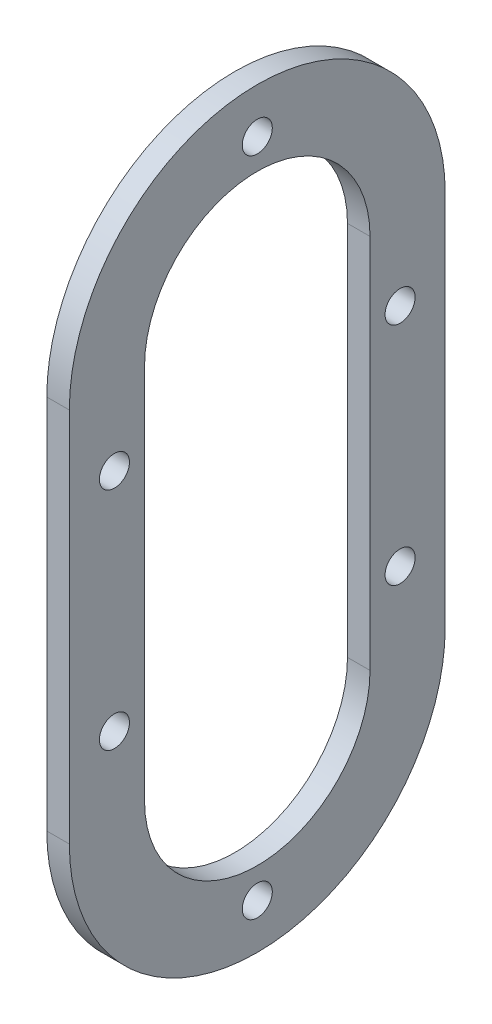
ISO-10303-21;
HEADER;
FILE_DESCRIPTION(('STEP AP214'),'2;1');
FILE_NAME('part.step','',(''),(''),'','','');
FILE_SCHEMA(('AUTOMOTIVE_DESIGN { 1 0 10303 214 1 1 1 1 }'));
ENDSEC;
DATA;
#1=APPLICATION_CONTEXT('core data for automotive mechanical design processes');
#2=APPLICATION_PROTOCOL_DEFINITION('international standard','automotive_design',2000,#1);
#3=PRODUCT_CONTEXT('',#1,'mechanical');
#4=PRODUCT('Part','Part','',(#3));
#5=PRODUCT_RELATED_PRODUCT_CATEGORY('part','',(#4));
#6=PRODUCT_DEFINITION_FORMATION('','',#4);
#7=PRODUCT_DEFINITION_CONTEXT('part definition',#1,'design');
#8=PRODUCT_DEFINITION('design','',#6,#7);
#9=PRODUCT_DEFINITION_SHAPE('','',#8);
#10=(LENGTH_UNIT() NAMED_UNIT(*) SI_UNIT(.MILLI.,.METRE.));
#11=(NAMED_UNIT(*) PLANE_ANGLE_UNIT() SI_UNIT($,.RADIAN.));
#12=(NAMED_UNIT(*) SI_UNIT($,.STERADIAN.) SOLID_ANGLE_UNIT());
#13=UNCERTAINTY_MEASURE_WITH_UNIT(LENGTH_MEASURE(1.E-05),#10,'distance_accuracy_value','');
#14=(GEOMETRIC_REPRESENTATION_CONTEXT(3) GLOBAL_UNCERTAINTY_ASSIGNED_CONTEXT((#13)) GLOBAL_UNIT_ASSIGNED_CONTEXT((#10,
#11,#12)) REPRESENTATION_CONTEXT('',''));
#15=CARTESIAN_POINT('',(0.,0.,0.));
#16=DIRECTION('',(0.,0.,1.));
#17=DIRECTION('',(1.,0.,0.));
#18=AXIS2_PLACEMENT_3D('',#15,#16,#17);
#19=CARTESIAN_POINT('',(3.,0.,0.));
#20=DIRECTION('',(1.,0.,0.));
#21=DIRECTION('',(0.,0.,-1.));
#22=AXIS2_PLACEMENT_3D('',#19,#20,#21);
#23=PLANE('',#22);
#24=CARTESIAN_POINT('',(3.,10.,-19.));
#25=DIRECTION('',(1.,0.,0.));
#26=DIRECTION('',(0.,0.,-1.));
#27=AXIS2_PLACEMENT_3D('',#24,#25,#26);
#28=CIRCLE('',#27,2.);
#29=CARTESIAN_POINT('',(3.,10.,-21.));
#30=VERTEX_POINT('',#29);
#31=EDGE_CURVE('E261',#30,#30,#28,.T.);
#32=ORIENTED_EDGE('',*,*,#31,.F.);
#33=EDGE_LOOP('',(#32));
#34=FACE_BOUND('',#33,.T.);
#35=CARTESIAN_POINT('',(3.,69.,0.));
#36=DIRECTION('',(1.,0.,0.));
#37=DIRECTION('',(0.,0.,-1.));
#38=AXIS2_PLACEMENT_3D('',#35,#36,#37);
#39=CIRCLE('',#38,2.);
#40=CARTESIAN_POINT('',(3.,69.,-2.));
#41=VERTEX_POINT('',#40);
#42=EDGE_CURVE('E273',#41,#41,#39,.T.);
#43=ORIENTED_EDGE('',*,*,#42,.F.);
#44=EDGE_LOOP('',(#43));
#45=FACE_BOUND('',#44,.T.);
#46=CARTESIAN_POINT('',(3.,10.,19.));
#47=DIRECTION('',(1.,0.,0.));
#48=DIRECTION('',(0.,0.,-1.));
#49=AXIS2_PLACEMENT_3D('',#46,#47,#48);
#50=CIRCLE('',#49,2.);
#51=CARTESIAN_POINT('',(3.,10.,17.));
#52=VERTEX_POINT('',#51);
#53=EDGE_CURVE('E135',#52,#52,#50,.T.);
#54=ORIENTED_EDGE('',*,*,#53,.F.);
#55=EDGE_LOOP('',(#54));
#56=FACE_BOUND('',#55,.T.);
#57=CARTESIAN_POINT('',(3.,0.,0.));
#58=DIRECTION('',(1.,0.,0.));
#59=DIRECTION('',(0.,0.,-1.));
#60=AXIS2_PLACEMENT_3D('',#57,#58,#59);
#61=CIRCLE('',#60,25.);
#62=CARTESIAN_POINT('',(3.,0.,25.));
#63=VERTEX_POINT('',#62);
#64=CARTESIAN_POINT('',(3.,0.,-25.));
#65=VERTEX_POINT('',#64);
#66=EDGE_CURVE('E145',#63,#65,#61,.T.);
#67=ORIENTED_EDGE('',*,*,#66,.T.);
#68=DIRECTION('',(0.,1.,0.));
#69=VECTOR('',#68,1.);
#70=CARTESIAN_POINT('',(3.,0.,-25.));
#71=LINE('',#70,#69);
#72=CARTESIAN_POINT('',(3.,50.,-25.));
#73=VERTEX_POINT('',#72);
#74=EDGE_CURVE('E148',#65,#73,#71,.T.);
#75=ORIENTED_EDGE('',*,*,#74,.T.);
#76=CARTESIAN_POINT('',(3.,50.,0.));
#77=DIRECTION('',(1.,0.,0.));
#78=DIRECTION('',(0.,0.,-1.));
#79=AXIS2_PLACEMENT_3D('',#76,#77,#78);
#80=CIRCLE('',#79,25.);
#81=CARTESIAN_POINT('',(3.,50.,25.));
#82=VERTEX_POINT('',#81);
#83=EDGE_CURVE('E151',#73,#82,#80,.T.);
#84=ORIENTED_EDGE('',*,*,#83,.T.);
#85=DIRECTION('',(0.,-1.,0.));
#86=VECTOR('',#85,1.);
#87=CARTESIAN_POINT('',(3.,0.,25.));
#88=LINE('',#87,#86);
#89=EDGE_CURVE('E153',#82,#63,#88,.T.);
#90=ORIENTED_EDGE('',*,*,#89,.T.);
#91=EDGE_LOOP('',(#67,#75,#84,#90));
#92=FACE_BOUND('',#91,.T.);
#93=DIRECTION('',(0.,1.,0.));
#94=VECTOR('',#93,1.);
#95=CARTESIAN_POINT('',(3.,0.,-15.));
#96=LINE('',#95,#94);
#97=CARTESIAN_POINT('',(3.,0.,-15.));
#98=VERTEX_POINT('',#97);
#99=CARTESIAN_POINT('',(3.,50.,-15.));
#100=VERTEX_POINT('',#99);
#101=EDGE_CURVE('E114',#98,#100,#96,.T.);
#102=ORIENTED_EDGE('',*,*,#101,.F.);
#103=CARTESIAN_POINT('',(3.,0.,0.));
#104=DIRECTION('',(1.,0.,0.));
#105=DIRECTION('',(0.,0.,-1.));
#106=AXIS2_PLACEMENT_3D('',#103,#104,#105);
#107=CIRCLE('',#106,15.);
#108=CARTESIAN_POINT('',(3.,0.,15.));
#109=VERTEX_POINT('',#108);
#110=EDGE_CURVE('E106',#109,#98,#107,.T.);
#111=ORIENTED_EDGE('',*,*,#110,.F.);
#112=DIRECTION('',(0.,-1.,0.));
#113=VECTOR('',#112,1.);
#114=CARTESIAN_POINT('',(3.,0.,15.));
#115=LINE('',#114,#113);
#116=CARTESIAN_POINT('',(3.,50.,15.));
#117=VERTEX_POINT('',#116);
#118=EDGE_CURVE('E129',#117,#109,#115,.T.);
#119=ORIENTED_EDGE('',*,*,#118,.F.);
#120=CARTESIAN_POINT('',(3.,50.,0.));
#121=DIRECTION('',(1.,0.,0.));
#122=DIRECTION('',(0.,0.,-1.));
#123=AXIS2_PLACEMENT_3D('',#120,#121,#122);
#124=CIRCLE('',#123,15.);
#125=EDGE_CURVE('E127',#100,#117,#124,.T.);
#126=ORIENTED_EDGE('',*,*,#125,.F.);
#127=EDGE_LOOP('',(#102,#111,#119,#126));
#128=FACE_BOUND('',#127,.T.);
#129=CARTESIAN_POINT('',(3.,40.,19.));
#130=DIRECTION('',(1.,0.,0.));
#131=DIRECTION('',(0.,0.,-1.));
#132=AXIS2_PLACEMENT_3D('',#129,#130,#131);
#133=CIRCLE('',#132,2.);
#134=CARTESIAN_POINT('',(3.,40.,17.));
#135=VERTEX_POINT('',#134);
#136=EDGE_CURVE('E279',#135,#135,#133,.T.);
#137=ORIENTED_EDGE('',*,*,#136,.F.);
#138=EDGE_LOOP('',(#137));
#139=FACE_BOUND('',#138,.T.);
#140=CARTESIAN_POINT('',(3.,-19.,0.));
#141=DIRECTION('',(1.,0.,0.));
#142=DIRECTION('',(0.,0.,-1.));
#143=AXIS2_PLACEMENT_3D('',#140,#141,#142);
#144=CIRCLE('',#143,2.);
#145=CARTESIAN_POINT('',(3.,-19.,-2.));
#146=VERTEX_POINT('',#145);
#147=EDGE_CURVE('E267',#146,#146,#144,.T.);
#148=ORIENTED_EDGE('',*,*,#147,.F.);
#149=EDGE_LOOP('',(#148));
#150=FACE_BOUND('',#149,.T.);
#151=CARTESIAN_POINT('',(3.,40.,-19.));
#152=DIRECTION('',(1.,0.,0.));
#153=DIRECTION('',(0.,0.,-1.));
#154=AXIS2_PLACEMENT_3D('',#151,#152,#153);
#155=CIRCLE('',#154,2.);
#156=CARTESIAN_POINT('',(3.,40.,-21.));
#157=VERTEX_POINT('',#156);
#158=EDGE_CURVE('E252',#157,#157,#155,.T.);
#159=ORIENTED_EDGE('',*,*,#158,.F.);
#160=EDGE_LOOP('',(#159));
#161=FACE_BOUND('',#160,.T.);
#162=ADVANCED_FACE('F41',(#34,#45,#56,#92,#128,#139,#150,#161),#23,.T.);
#163=CARTESIAN_POINT('',(0.,0.,0.));
#164=DIRECTION('',(1.,0.,0.));
#165=DIRECTION('',(0.,0.,-1.));
#166=AXIS2_PLACEMENT_3D('',#163,#164,#165);
#167=PLANE('',#166);
#168=CARTESIAN_POINT('',(0.,0.,0.));
#169=DIRECTION('',(1.,0.,0.));
#170=DIRECTION('',(0.,0.,-1.));
#171=AXIS2_PLACEMENT_3D('',#168,#169,#170);
#172=CIRCLE('',#171,25.);
#173=CARTESIAN_POINT('',(0.,0.,25.));
#174=VERTEX_POINT('',#173);
#175=CARTESIAN_POINT('',(0.,0.,-25.));
#176=VERTEX_POINT('',#175);
#177=EDGE_CURVE('E122',#174,#176,#172,.T.);
#178=ORIENTED_EDGE('',*,*,#177,.F.);
#179=DIRECTION('',(0.,-1.,0.));
#180=VECTOR('',#179,1.);
#181=CARTESIAN_POINT('',(0.,0.,25.));
#182=LINE('',#181,#180);
#183=CARTESIAN_POINT('',(0.,50.,25.));
#184=VERTEX_POINT('',#183);
#185=EDGE_CURVE('E149',#184,#174,#182,.T.);
#186=ORIENTED_EDGE('',*,*,#185,.F.);
#187=CARTESIAN_POINT('',(0.,50.,0.));
#188=DIRECTION('',(1.,0.,0.));
#189=DIRECTION('',(0.,0.,-1.));
#190=AXIS2_PLACEMENT_3D('',#187,#188,#189);
#191=CIRCLE('',#190,25.);
#192=CARTESIAN_POINT('',(0.,50.,-25.));
#193=VERTEX_POINT('',#192);
#194=EDGE_CURVE('E160',#193,#184,#191,.T.);
#195=ORIENTED_EDGE('',*,*,#194,.F.);
#196=DIRECTION('',(0.,1.,0.));
#197=VECTOR('',#196,1.);
#198=CARTESIAN_POINT('',(0.,0.,-25.));
#199=LINE('',#198,#197);
#200=EDGE_CURVE('E158',#176,#193,#199,.T.);
#201=ORIENTED_EDGE('',*,*,#200,.F.);
#202=EDGE_LOOP('',(#178,#186,#195,#201));
#203=FACE_BOUND('',#202,.T.);
#204=CARTESIAN_POINT('',(0.,0.,0.));
#205=DIRECTION('',(1.,0.,0.));
#206=DIRECTION('',(0.,0.,-1.));
#207=AXIS2_PLACEMENT_3D('',#204,#205,#206);
#208=CIRCLE('',#207,15.);
#209=CARTESIAN_POINT('',(0.,0.,15.));
#210=VERTEX_POINT('',#209);
#211=CARTESIAN_POINT('',(0.,0.,-15.));
#212=VERTEX_POINT('',#211);
#213=EDGE_CURVE('E64',#210,#212,#208,.T.);
#214=ORIENTED_EDGE('',*,*,#213,.T.);
#215=DIRECTION('',(0.,1.,0.));
#216=VECTOR('',#215,1.);
#217=CARTESIAN_POINT('',(0.,0.,-15.));
#218=LINE('',#217,#216);
#219=CARTESIAN_POINT('',(0.,50.,-15.));
#220=VERTEX_POINT('',#219);
#221=EDGE_CURVE('E121',#212,#220,#218,.T.);
#222=ORIENTED_EDGE('',*,*,#221,.T.);
#223=CARTESIAN_POINT('',(0.,50.,0.));
#224=DIRECTION('',(1.,0.,0.));
#225=DIRECTION('',(0.,0.,-1.));
#226=AXIS2_PLACEMENT_3D('',#223,#224,#225);
#227=CIRCLE('',#226,15.);
#228=CARTESIAN_POINT('',(0.,50.,15.));
#229=VERTEX_POINT('',#228);
#230=EDGE_CURVE('E137',#220,#229,#227,.T.);
#231=ORIENTED_EDGE('',*,*,#230,.T.);
#232=DIRECTION('',(0.,-1.,0.));
#233=VECTOR('',#232,1.);
#234=CARTESIAN_POINT('',(0.,0.,15.));
#235=LINE('',#234,#233);
#236=EDGE_CURVE('E115',#229,#210,#235,.T.);
#237=ORIENTED_EDGE('',*,*,#236,.T.);
#238=EDGE_LOOP('',(#214,#222,#231,#237));
#239=FACE_BOUND('',#238,.T.);
#240=CARTESIAN_POINT('',(0.,10.,19.));
#241=DIRECTION('',(1.,0.,0.));
#242=DIRECTION('',(0.,0.,-1.));
#243=AXIS2_PLACEMENT_3D('',#240,#241,#242);
#244=CIRCLE('',#243,2.);
#245=CARTESIAN_POINT('',(0.,10.,17.));
#246=VERTEX_POINT('',#245);
#247=EDGE_CURVE('E282',#246,#246,#244,.T.);
#248=ORIENTED_EDGE('',*,*,#247,.T.);
#249=EDGE_LOOP('',(#248));
#250=FACE_BOUND('',#249,.T.);
#251=CARTESIAN_POINT('',(0.,40.,19.));
#252=DIRECTION('',(1.,0.,0.));
#253=DIRECTION('',(0.,0.,-1.));
#254=AXIS2_PLACEMENT_3D('',#251,#252,#253);
#255=CIRCLE('',#254,2.);
#256=CARTESIAN_POINT('',(0.,40.,17.));
#257=VERTEX_POINT('',#256);
#258=EDGE_CURVE('E276',#257,#257,#255,.T.);
#259=ORIENTED_EDGE('',*,*,#258,.T.);
#260=EDGE_LOOP('',(#259));
#261=FACE_BOUND('',#260,.T.);
#262=CARTESIAN_POINT('',(0.,69.,0.));
#263=DIRECTION('',(1.,0.,0.));
#264=DIRECTION('',(0.,0.,-1.));
#265=AXIS2_PLACEMENT_3D('',#262,#263,#264);
#266=CIRCLE('',#265,2.);
#267=CARTESIAN_POINT('',(0.,69.,-2.));
#268=VERTEX_POINT('',#267);
#269=EDGE_CURVE('E270',#268,#268,#266,.T.);
#270=ORIENTED_EDGE('',*,*,#269,.T.);
#271=EDGE_LOOP('',(#270));
#272=FACE_BOUND('',#271,.T.);
#273=CARTESIAN_POINT('',(0.,-19.,0.));
#274=DIRECTION('',(1.,0.,0.));
#275=DIRECTION('',(0.,0.,-1.));
#276=AXIS2_PLACEMENT_3D('',#273,#274,#275);
#277=CIRCLE('',#276,2.);
#278=CARTESIAN_POINT('',(0.,-19.,-2.));
#279=VERTEX_POINT('',#278);
#280=EDGE_CURVE('E264',#279,#279,#277,.T.);
#281=ORIENTED_EDGE('',*,*,#280,.T.);
#282=EDGE_LOOP('',(#281));
#283=FACE_BOUND('',#282,.T.);
#284=CARTESIAN_POINT('',(0.,10.,-19.));
#285=DIRECTION('',(1.,0.,0.));
#286=DIRECTION('',(0.,0.,-1.));
#287=AXIS2_PLACEMENT_3D('',#284,#285,#286);
#288=CIRCLE('',#287,2.);
#289=CARTESIAN_POINT('',(0.,10.,-21.));
#290=VERTEX_POINT('',#289);
#291=EDGE_CURVE('E258',#290,#290,#288,.T.);
#292=ORIENTED_EDGE('',*,*,#291,.T.);
#293=EDGE_LOOP('',(#292));
#294=FACE_BOUND('',#293,.T.);
#295=CARTESIAN_POINT('',(0.,40.,-19.));
#296=DIRECTION('',(1.,0.,0.));
#297=DIRECTION('',(0.,0.,-1.));
#298=AXIS2_PLACEMENT_3D('',#295,#296,#297);
#299=CIRCLE('',#298,2.);
#300=CARTESIAN_POINT('',(0.,40.,-21.));
#301=VERTEX_POINT('',#300);
#302=EDGE_CURVE('E255',#301,#301,#299,.T.);
#303=ORIENTED_EDGE('',*,*,#302,.T.);
#304=EDGE_LOOP('',(#303));
#305=FACE_BOUND('',#304,.T.);
#306=ADVANCED_FACE('F178',(#203,#239,#250,#261,#272,#283,#294,#305),#167,.F.);
#307=CARTESIAN_POINT('',(3.,0.,0.));
#308=DIRECTION('',(-1.,0.,0.));
#309=DIRECTION('',(0.,0.,1.));
#310=AXIS2_PLACEMENT_3D('',#307,#308,#309);
#311=CYLINDRICAL_SURFACE('',#310,25.);
#312=ORIENTED_EDGE('',*,*,#177,.T.);
#313=DIRECTION('',(-1.,0.,0.));
#314=VECTOR('',#313,1.);
#315=CARTESIAN_POINT('',(3.,0.,-25.));
#316=LINE('',#315,#314);
#317=EDGE_CURVE('E11',#65,#176,#316,.T.);
#318=ORIENTED_EDGE('',*,*,#317,.F.);
#319=ORIENTED_EDGE('',*,*,#66,.F.);
#320=DIRECTION('',(-1.,0.,0.));
#321=VECTOR('',#320,1.);
#322=CARTESIAN_POINT('',(3.,0.,25.));
#323=LINE('',#322,#321);
#324=EDGE_CURVE('E155',#63,#174,#323,.T.);
#325=ORIENTED_EDGE('',*,*,#324,.T.);
#326=EDGE_LOOP('',(#312,#318,#319,#325));
#327=FACE_BOUND('',#326,.T.);
#328=ADVANCED_FACE('F43',(#327),#311,.T.);
#329=CARTESIAN_POINT('',(3.,0.,-25.));
#330=DIRECTION('',(0.,0.,1.));
#331=DIRECTION('',(1.,0.,0.));
#332=AXIS2_PLACEMENT_3D('',#329,#330,#331);
#333=PLANE('',#332);
#334=ORIENTED_EDGE('',*,*,#200,.T.);
#335=DIRECTION('',(-1.,0.,0.));
#336=VECTOR('',#335,1.);
#337=CARTESIAN_POINT('',(3.,50.,-25.));
#338=LINE('',#337,#336);
#339=EDGE_CURVE('E49',#73,#193,#338,.T.);
#340=ORIENTED_EDGE('',*,*,#339,.F.);
#341=ORIENTED_EDGE('',*,*,#74,.F.);
#342=ORIENTED_EDGE('',*,*,#317,.T.);
#343=EDGE_LOOP('',(#334,#340,#341,#342));
#344=FACE_BOUND('',#343,.T.);
#345=ADVANCED_FACE('F188',(#344),#333,.F.);
#346=CARTESIAN_POINT('',(3.,50.,0.));
#347=DIRECTION('',(-1.,0.,0.));
#348=DIRECTION('',(0.,0.,1.));
#349=AXIS2_PLACEMENT_3D('',#346,#347,#348);
#350=CYLINDRICAL_SURFACE('',#349,25.);
#351=ORIENTED_EDGE('',*,*,#194,.T.);
#352=DIRECTION('',(-1.,0.,0.));
#353=VECTOR('',#352,1.);
#354=CARTESIAN_POINT('',(3.,50.,25.));
#355=LINE('',#354,#353);
#356=EDGE_CURVE('E165',#82,#184,#355,.T.);
#357=ORIENTED_EDGE('',*,*,#356,.F.);
#358=ORIENTED_EDGE('',*,*,#83,.F.);
#359=ORIENTED_EDGE('',*,*,#339,.T.);
#360=EDGE_LOOP('',(#351,#357,#358,#359));
#361=FACE_BOUND('',#360,.T.);
#362=ADVANCED_FACE('F172',(#361),#350,.T.);
#363=CARTESIAN_POINT('',(3.,0.,25.));
#364=DIRECTION('',(0.,0.,-1.));
#365=DIRECTION('',(-1.,0.,0.));
#366=AXIS2_PLACEMENT_3D('',#363,#364,#365);
#367=PLANE('',#366);
#368=ORIENTED_EDGE('',*,*,#185,.T.);
#369=ORIENTED_EDGE('',*,*,#324,.F.);
#370=ORIENTED_EDGE('',*,*,#89,.F.);
#371=ORIENTED_EDGE('',*,*,#356,.T.);
#372=EDGE_LOOP('',(#368,#369,#370,#371));
#373=FACE_BOUND('',#372,.T.);
#374=ADVANCED_FACE('F182',(#373),#367,.F.);
#375=CARTESIAN_POINT('',(3.,0.,0.));
#376=DIRECTION('',(-1.,0.,0.));
#377=DIRECTION('',(0.,0.,1.));
#378=AXIS2_PLACEMENT_3D('',#375,#376,#377);
#379=CYLINDRICAL_SURFACE('',#378,15.);
#380=ORIENTED_EDGE('',*,*,#213,.F.);
#381=DIRECTION('',(-1.,0.,0.));
#382=VECTOR('',#381,1.);
#383=CARTESIAN_POINT('',(3.,0.,15.));
#384=LINE('',#383,#382);
#385=EDGE_CURVE('E110',#109,#210,#384,.T.);
#386=ORIENTED_EDGE('',*,*,#385,.F.);
#387=ORIENTED_EDGE('',*,*,#110,.T.);
#388=DIRECTION('',(-1.,0.,0.));
#389=VECTOR('',#388,1.);
#390=CARTESIAN_POINT('',(3.,0.,-15.));
#391=LINE('',#390,#389);
#392=EDGE_CURVE('E109',#98,#212,#391,.T.);
#393=ORIENTED_EDGE('',*,*,#392,.T.);
#394=EDGE_LOOP('',(#380,#386,#387,#393));
#395=FACE_BOUND('',#394,.T.);
#396=ADVANCED_FACE('F108',(#395),#379,.F.);
#397=CARTESIAN_POINT('',(3.,0.,-15.));
#398=DIRECTION('',(0.,0.,1.));
#399=DIRECTION('',(0.,-1.,0.));
#400=AXIS2_PLACEMENT_3D('',#397,#398,#399);
#401=PLANE('',#400);
#402=ORIENTED_EDGE('',*,*,#221,.F.);
#403=ORIENTED_EDGE('',*,*,#392,.F.);
#404=ORIENTED_EDGE('',*,*,#101,.T.);
#405=DIRECTION('',(-1.,0.,0.));
#406=VECTOR('',#405,1.);
#407=CARTESIAN_POINT('',(3.,50.,-15.));
#408=LINE('',#407,#406);
#409=EDGE_CURVE('E123',#100,#220,#408,.T.);
#410=ORIENTED_EDGE('',*,*,#409,.T.);
#411=EDGE_LOOP('',(#402,#403,#404,#410));
#412=FACE_BOUND('',#411,.T.);
#413=ADVANCED_FACE('F118',(#412),#401,.T.);
#414=CARTESIAN_POINT('',(3.,50.,0.));
#415=DIRECTION('',(-1.,0.,0.));
#416=DIRECTION('',(0.,0.,1.));
#417=AXIS2_PLACEMENT_3D('',#414,#415,#416);
#418=CYLINDRICAL_SURFACE('',#417,15.);
#419=ORIENTED_EDGE('',*,*,#230,.F.);
#420=ORIENTED_EDGE('',*,*,#409,.F.);
#421=ORIENTED_EDGE('',*,*,#125,.T.);
#422=DIRECTION('',(-1.,0.,0.));
#423=VECTOR('',#422,1.);
#424=CARTESIAN_POINT('',(3.,50.,15.));
#425=LINE('',#424,#423);
#426=EDGE_CURVE('E56',#117,#229,#425,.T.);
#427=ORIENTED_EDGE('',*,*,#426,.T.);
#428=EDGE_LOOP('',(#419,#420,#421,#427));
#429=FACE_BOUND('',#428,.T.);
#430=ADVANCED_FACE('F214',(#429),#418,.F.);
#431=CARTESIAN_POINT('',(3.,0.,15.));
#432=DIRECTION('',(0.,0.,-1.));
#433=DIRECTION('',(-1.,0.,0.));
#434=AXIS2_PLACEMENT_3D('',#431,#432,#433);
#435=PLANE('',#434);
#436=ORIENTED_EDGE('',*,*,#236,.F.);
#437=ORIENTED_EDGE('',*,*,#426,.F.);
#438=ORIENTED_EDGE('',*,*,#118,.T.);
#439=ORIENTED_EDGE('',*,*,#385,.T.);
#440=EDGE_LOOP('',(#436,#437,#438,#439));
#441=FACE_BOUND('',#440,.T.);
#442=ADVANCED_FACE('F218',(#441),#435,.T.);
#443=CARTESIAN_POINT('',(3.,10.,19.));
#444=DIRECTION('',(-1.,0.,0.));
#445=DIRECTION('',(0.,0.,1.));
#446=AXIS2_PLACEMENT_3D('',#443,#444,#445);
#447=CYLINDRICAL_SURFACE('',#446,2.);
#448=ORIENTED_EDGE('',*,*,#53,.T.);
#449=EDGE_LOOP('',(#448));
#450=FACE_BOUND('',#449,.T.);
#451=ORIENTED_EDGE('',*,*,#247,.F.);
#452=EDGE_LOOP('',(#451));
#453=FACE_BOUND('',#452,.T.);
#454=ADVANCED_FACE('F224',(#450,#453),#447,.F.);
#455=CARTESIAN_POINT('',(3.,40.,19.));
#456=DIRECTION('',(-1.,0.,0.));
#457=DIRECTION('',(0.,0.,1.));
#458=AXIS2_PLACEMENT_3D('',#455,#456,#457);
#459=CYLINDRICAL_SURFACE('',#458,2.);
#460=ORIENTED_EDGE('',*,*,#136,.T.);
#461=EDGE_LOOP('',(#460));
#462=FACE_BOUND('',#461,.T.);
#463=ORIENTED_EDGE('',*,*,#258,.F.);
#464=EDGE_LOOP('',(#463));
#465=FACE_BOUND('',#464,.T.);
#466=ADVANCED_FACE('F227',(#462,#465),#459,.F.);
#467=CARTESIAN_POINT('',(3.,69.,0.));
#468=DIRECTION('',(-1.,0.,0.));
#469=DIRECTION('',(0.,0.,1.));
#470=AXIS2_PLACEMENT_3D('',#467,#468,#469);
#471=CYLINDRICAL_SURFACE('',#470,2.);
#472=ORIENTED_EDGE('',*,*,#42,.T.);
#473=EDGE_LOOP('',(#472));
#474=FACE_BOUND('',#473,.T.);
#475=ORIENTED_EDGE('',*,*,#269,.F.);
#476=EDGE_LOOP('',(#475));
#477=FACE_BOUND('',#476,.T.);
#478=ADVANCED_FACE('F231',(#474,#477),#471,.F.);
#479=CARTESIAN_POINT('',(3.,-19.,0.));
#480=DIRECTION('',(-1.,0.,0.));
#481=DIRECTION('',(0.,0.,1.));
#482=AXIS2_PLACEMENT_3D('',#479,#480,#481);
#483=CYLINDRICAL_SURFACE('',#482,2.);
#484=ORIENTED_EDGE('',*,*,#147,.T.);
#485=EDGE_LOOP('',(#484));
#486=FACE_BOUND('',#485,.T.);
#487=ORIENTED_EDGE('',*,*,#280,.F.);
#488=EDGE_LOOP('',(#487));
#489=FACE_BOUND('',#488,.T.);
#490=ADVANCED_FACE('F235',(#486,#489),#483,.F.);
#491=CARTESIAN_POINT('',(3.,10.,-19.));
#492=DIRECTION('',(-1.,0.,0.));
#493=DIRECTION('',(0.,0.,1.));
#494=AXIS2_PLACEMENT_3D('',#491,#492,#493);
#495=CYLINDRICAL_SURFACE('',#494,2.);
#496=ORIENTED_EDGE('',*,*,#31,.T.);
#497=EDGE_LOOP('',(#496));
#498=FACE_BOUND('',#497,.T.);
#499=ORIENTED_EDGE('',*,*,#291,.F.);
#500=EDGE_LOOP('',(#499));
#501=FACE_BOUND('',#500,.T.);
#502=ADVANCED_FACE('F239',(#498,#501),#495,.F.);
#503=CARTESIAN_POINT('',(3.,40.,-19.));
#504=DIRECTION('',(-1.,0.,0.));
#505=DIRECTION('',(0.,0.,1.));
#506=AXIS2_PLACEMENT_3D('',#503,#504,#505);
#507=CYLINDRICAL_SURFACE('',#506,2.);
#508=ORIENTED_EDGE('',*,*,#158,.T.);
#509=EDGE_LOOP('',(#508));
#510=FACE_BOUND('',#509,.T.);
#511=ORIENTED_EDGE('',*,*,#302,.F.);
#512=EDGE_LOOP('',(#511));
#513=FACE_BOUND('',#512,.T.);
#514=ADVANCED_FACE('F243',(#510,#513),#507,.F.);
#515=CLOSED_SHELL('',(#162,#306,#328,#345,#362,#374,#396,#413,#430,#442,#454,#466,#478,#490,
#502,#514));
#516=MANIFOLD_SOLID_BREP('B2',#515);
#517=ADVANCED_BREP_SHAPE_REPRESENTATION('',(#18,#516),#14);
#518=SHAPE_DEFINITION_REPRESENTATION(#9,#517);
ENDSEC;
END-ISO-10303-21;
